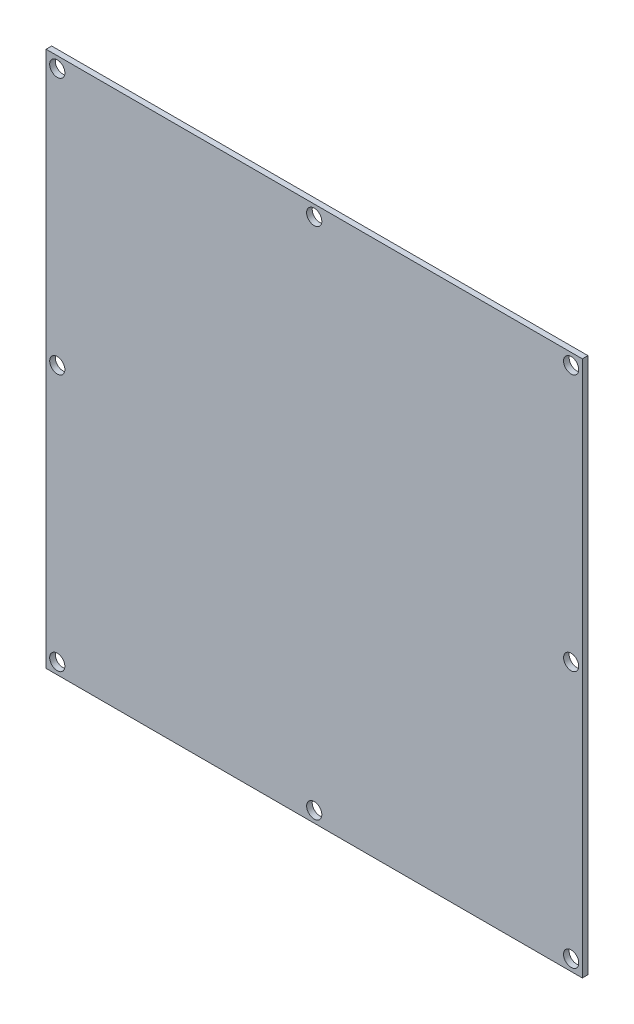
ISO-10303-21;
HEADER;
FILE_DESCRIPTION(('STEP AP214'),'2;1');
FILE_NAME('part.step','',(''),(''),'','','');
FILE_SCHEMA(('AUTOMOTIVE_DESIGN { 1 0 10303 214 1 1 1 1 }'));
ENDSEC;
DATA;
#1=APPLICATION_CONTEXT('core data for automotive mechanical design processes');
#2=APPLICATION_PROTOCOL_DEFINITION('international standard','automotive_design',2000,#1);
#3=PRODUCT_CONTEXT('',#1,'mechanical');
#4=PRODUCT('Part','Part','',(#3));
#5=PRODUCT_RELATED_PRODUCT_CATEGORY('part','',(#4));
#6=PRODUCT_DEFINITION_FORMATION('','',#4);
#7=PRODUCT_DEFINITION_CONTEXT('part definition',#1,'design');
#8=PRODUCT_DEFINITION('design','',#6,#7);
#9=PRODUCT_DEFINITION_SHAPE('','',#8);
#10=(LENGTH_UNIT() NAMED_UNIT(*) SI_UNIT(.MILLI.,.METRE.));
#11=(NAMED_UNIT(*) PLANE_ANGLE_UNIT() SI_UNIT($,.RADIAN.));
#12=(NAMED_UNIT(*) SI_UNIT($,.STERADIAN.) SOLID_ANGLE_UNIT());
#13=UNCERTAINTY_MEASURE_WITH_UNIT(LENGTH_MEASURE(1.E-05),#10,'distance_accuracy_value','');
#14=(GEOMETRIC_REPRESENTATION_CONTEXT(3) GLOBAL_UNCERTAINTY_ASSIGNED_CONTEXT((#13)) GLOBAL_UNIT_ASSIGNED_CONTEXT((#10,
#11,#12)) REPRESENTATION_CONTEXT('',''));
#15=CARTESIAN_POINT('',(0.,0.,0.));
#16=DIRECTION('',(0.,0.,1.));
#17=DIRECTION('',(1.,0.,0.));
#18=AXIS2_PLACEMENT_3D('',#15,#16,#17);
#19=CARTESIAN_POINT('',(0.,0.,1.5875));
#20=DIRECTION('',(1.,0.,0.));
#21=DIRECTION('',(0.,0.,-1.));
#22=AXIS2_PLACEMENT_3D('',#19,#20,#21);
#23=PLANE('',#22);
#24=DIRECTION('',(0.,-1.,0.));
#25=VECTOR('',#24,1.);
#26=CARTESIAN_POINT('',(0.,0.,0.));
#27=LINE('',#26,#25);
#28=CARTESIAN_POINT('',(0.,152.4,0.));
#29=VERTEX_POINT('',#28);
#30=CARTESIAN_POINT('',(0.,0.,0.));
#31=VERTEX_POINT('',#30);
#32=EDGE_CURVE('E96',#29,#31,#27,.T.);
#33=ORIENTED_EDGE('',*,*,#32,.T.);
#34=DIRECTION('',(0.,0.,-1.));
#35=VECTOR('',#34,1.);
#36=CARTESIAN_POINT('',(0.,0.,1.5875));
#37=LINE('',#36,#35);
#38=CARTESIAN_POINT('',(0.,0.,1.5875));
#39=VERTEX_POINT('',#38);
#40=EDGE_CURVE('E11',#39,#31,#37,.T.);
#41=ORIENTED_EDGE('',*,*,#40,.F.);
#42=DIRECTION('',(0.,-1.,0.));
#43=VECTOR('',#42,1.);
#44=CARTESIAN_POINT('',(0.,0.,1.5875));
#45=LINE('',#44,#43);
#46=CARTESIAN_POINT('',(0.,152.4,1.5875));
#47=VERTEX_POINT('',#46);
#48=EDGE_CURVE('E84',#47,#39,#45,.T.);
#49=ORIENTED_EDGE('',*,*,#48,.F.);
#50=DIRECTION('',(0.,0.,-1.));
#51=VECTOR('',#50,1.);
#52=CARTESIAN_POINT('',(0.,152.4,1.5875));
#53=LINE('',#52,#51);
#54=EDGE_CURVE('E92',#47,#29,#53,.T.);
#55=ORIENTED_EDGE('',*,*,#54,.T.);
#56=EDGE_LOOP('',(#33,#41,#49,#55));
#57=FACE_BOUND('',#56,.T.);
#58=ADVANCED_FACE('F33',(#57),#23,.F.);
#59=CARTESIAN_POINT('',(0.,0.,1.5875));
#60=DIRECTION('',(0.,1.,0.));
#61=DIRECTION('',(0.,0.,1.));
#62=AXIS2_PLACEMENT_3D('',#59,#60,#61);
#63=PLANE('',#62);
#64=DIRECTION('',(1.,0.,0.));
#65=VECTOR('',#64,1.);
#66=CARTESIAN_POINT('',(0.,0.,0.));
#67=LINE('',#66,#65);
#68=CARTESIAN_POINT('',(152.4,0.,0.));
#69=VERTEX_POINT('',#68);
#70=EDGE_CURVE('E88',#31,#69,#67,.T.);
#71=ORIENTED_EDGE('',*,*,#70,.T.);
#72=DIRECTION('',(0.,0.,-1.));
#73=VECTOR('',#72,1.);
#74=CARTESIAN_POINT('',(152.4,0.,1.5875));
#75=LINE('',#74,#73);
#76=CARTESIAN_POINT('',(152.4,0.,1.5875));
#77=VERTEX_POINT('',#76);
#78=EDGE_CURVE('E41',#77,#69,#75,.T.);
#79=ORIENTED_EDGE('',*,*,#78,.F.);
#80=DIRECTION('',(1.,0.,0.));
#81=VECTOR('',#80,1.);
#82=CARTESIAN_POINT('',(0.,0.,1.5875));
#83=LINE('',#82,#81);
#84=EDGE_CURVE('E79',#39,#77,#83,.T.);
#85=ORIENTED_EDGE('',*,*,#84,.F.);
#86=ORIENTED_EDGE('',*,*,#40,.T.);
#87=EDGE_LOOP('',(#71,#79,#85,#86));
#88=FACE_BOUND('',#87,.T.);
#89=ADVANCED_FACE('F87',(#88),#63,.F.);
#90=CARTESIAN_POINT('',(152.4,0.,1.5875));
#91=DIRECTION('',(-1.,0.,0.));
#92=DIRECTION('',(0.,0.,1.));
#93=AXIS2_PLACEMENT_3D('',#90,#91,#92);
#94=PLANE('',#93);
#95=DIRECTION('',(0.,1.,0.));
#96=VECTOR('',#95,1.);
#97=CARTESIAN_POINT('',(152.4,0.,0.));
#98=LINE('',#97,#96);
#99=CARTESIAN_POINT('',(152.4,152.4,0.));
#100=VERTEX_POINT('',#99);
#101=EDGE_CURVE('E66',#69,#100,#98,.T.);
#102=ORIENTED_EDGE('',*,*,#101,.T.);
#103=DIRECTION('',(0.,0.,-1.));
#104=VECTOR('',#103,1.);
#105=CARTESIAN_POINT('',(152.4,152.4,1.5875));
#106=LINE('',#105,#104);
#107=CARTESIAN_POINT('',(152.4,152.4,1.5875));
#108=VERTEX_POINT('',#107);
#109=EDGE_CURVE('E89',#108,#100,#106,.T.);
#110=ORIENTED_EDGE('',*,*,#109,.F.);
#111=DIRECTION('',(0.,1.,0.));
#112=VECTOR('',#111,1.);
#113=CARTESIAN_POINT('',(152.4,0.,1.5875));
#114=LINE('',#113,#112);
#115=EDGE_CURVE('E82',#77,#108,#114,.T.);
#116=ORIENTED_EDGE('',*,*,#115,.F.);
#117=ORIENTED_EDGE('',*,*,#78,.T.);
#118=EDGE_LOOP('',(#102,#110,#116,#117));
#119=FACE_BOUND('',#118,.T.);
#120=ADVANCED_FACE('F90',(#119),#94,.F.);
#121=CARTESIAN_POINT('',(0.,152.4,1.5875));
#122=DIRECTION('',(0.,-1.,0.));
#123=DIRECTION('',(0.,0.,-1.));
#124=AXIS2_PLACEMENT_3D('',#121,#122,#123);
#125=PLANE('',#124);
#126=DIRECTION('',(-1.,0.,0.));
#127=VECTOR('',#126,1.);
#128=CARTESIAN_POINT('',(0.,152.4,0.));
#129=LINE('',#128,#127);
#130=EDGE_CURVE('E72',#100,#29,#129,.T.);
#131=ORIENTED_EDGE('',*,*,#130,.T.);
#132=ORIENTED_EDGE('',*,*,#54,.F.);
#133=DIRECTION('',(-1.,0.,0.));
#134=VECTOR('',#133,1.);
#135=CARTESIAN_POINT('',(0.,152.4,1.5875));
#136=LINE('',#135,#134);
#137=EDGE_CURVE('E49',#108,#47,#136,.T.);
#138=ORIENTED_EDGE('',*,*,#137,.F.);
#139=ORIENTED_EDGE('',*,*,#109,.T.);
#140=EDGE_LOOP('',(#131,#132,#138,#139));
#141=FACE_BOUND('',#140,.T.);
#142=ADVANCED_FACE('F104',(#141),#125,.F.);
#143=CARTESIAN_POINT('',(0.,0.,1.5875));
#144=DIRECTION('',(0.,0.,-1.));
#145=DIRECTION('',(-1.,0.,0.));
#146=AXIS2_PLACEMENT_3D('',#143,#144,#145);
#147=PLANE('',#146);
#148=CARTESIAN_POINT('',(3.175,76.2,1.5875));
#149=DIRECTION('',(0.,0.,1.));
#150=DIRECTION('',(1.,0.,0.));
#151=AXIS2_PLACEMENT_3D('',#148,#149,#150);
#152=CIRCLE('',#151,2.159);
#153=CARTESIAN_POINT('',(5.334,76.2,1.5875));
#154=VERTEX_POINT('',#153);
#155=EDGE_CURVE('E152',#154,#154,#152,.T.);
#156=ORIENTED_EDGE('',*,*,#155,.F.);
#157=EDGE_LOOP('',(#156));
#158=FACE_BOUND('',#157,.T.);
#159=CARTESIAN_POINT('',(149.225,76.2,1.5875));
#160=DIRECTION('',(0.,0.,1.));
#161=DIRECTION('',(1.,0.,0.));
#162=AXIS2_PLACEMENT_3D('',#159,#160,#161);
#163=CIRCLE('',#162,2.15899999999999);
#164=CARTESIAN_POINT('',(151.384,76.2,1.5875));
#165=VERTEX_POINT('',#164);
#166=EDGE_CURVE('E146',#165,#165,#163,.T.);
#167=ORIENTED_EDGE('',*,*,#166,.F.);
#168=EDGE_LOOP('',(#167));
#169=FACE_BOUND('',#168,.T.);
#170=CARTESIAN_POINT('',(149.225,3.175,1.5875));
#171=DIRECTION('',(0.,0.,1.));
#172=DIRECTION('',(1.,0.,0.));
#173=AXIS2_PLACEMENT_3D('',#170,#171,#172);
#174=CIRCLE('',#173,2.15899999999999);
#175=CARTESIAN_POINT('',(151.384,3.175,1.5875));
#176=VERTEX_POINT('',#175);
#177=EDGE_CURVE('E140',#176,#176,#174,.T.);
#178=ORIENTED_EDGE('',*,*,#177,.F.);
#179=EDGE_LOOP('',(#178));
#180=FACE_BOUND('',#179,.T.);
#181=CARTESIAN_POINT('',(3.175,3.175,1.5875));
#182=DIRECTION('',(0.,0.,1.));
#183=DIRECTION('',(1.,0.,0.));
#184=AXIS2_PLACEMENT_3D('',#181,#182,#183);
#185=CIRCLE('',#184,2.159);
#186=CARTESIAN_POINT('',(5.334,3.175,1.5875));
#187=VERTEX_POINT('',#186);
#188=EDGE_CURVE('E134',#187,#187,#185,.T.);
#189=ORIENTED_EDGE('',*,*,#188,.F.);
#190=EDGE_LOOP('',(#189));
#191=FACE_BOUND('',#190,.T.);
#192=CARTESIAN_POINT('',(76.2,3.175,1.5875));
#193=DIRECTION('',(0.,0.,1.));
#194=DIRECTION('',(1.,0.,0.));
#195=AXIS2_PLACEMENT_3D('',#192,#193,#194);
#196=CIRCLE('',#195,2.15899999999999);
#197=CARTESIAN_POINT('',(78.359,3.175,1.5875));
#198=VERTEX_POINT('',#197);
#199=EDGE_CURVE('E128',#198,#198,#196,.T.);
#200=ORIENTED_EDGE('',*,*,#199,.F.);
#201=EDGE_LOOP('',(#200));
#202=FACE_BOUND('',#201,.T.);
#203=CARTESIAN_POINT('',(149.225,149.225,1.5875));
#204=DIRECTION('',(0.,0.,1.));
#205=DIRECTION('',(1.,0.,0.));
#206=AXIS2_PLACEMENT_3D('',#203,#204,#205);
#207=CIRCLE('',#206,2.15899999999999);
#208=CARTESIAN_POINT('',(151.384,149.225,1.5875));
#209=VERTEX_POINT('',#208);
#210=EDGE_CURVE('E122',#209,#209,#207,.T.);
#211=ORIENTED_EDGE('',*,*,#210,.F.);
#212=EDGE_LOOP('',(#211));
#213=FACE_BOUND('',#212,.T.);
#214=CARTESIAN_POINT('',(76.2,149.225,1.5875));
#215=DIRECTION('',(0.,0.,1.));
#216=DIRECTION('',(1.,0.,0.));
#217=AXIS2_PLACEMENT_3D('',#214,#215,#216);
#218=CIRCLE('',#217,2.15899999999999);
#219=CARTESIAN_POINT('',(78.359,149.225,1.5875));
#220=VERTEX_POINT('',#219);
#221=EDGE_CURVE('E116',#220,#220,#218,.T.);
#222=ORIENTED_EDGE('',*,*,#221,.F.);
#223=EDGE_LOOP('',(#222));
#224=FACE_BOUND('',#223,.T.);
#225=CARTESIAN_POINT('',(3.175,149.225,1.5875));
#226=DIRECTION('',(0.,0.,1.));
#227=DIRECTION('',(1.,0.,0.));
#228=AXIS2_PLACEMENT_3D('',#225,#226,#227);
#229=CIRCLE('',#228,2.159);
#230=CARTESIAN_POINT('',(5.334,149.225,1.5875));
#231=VERTEX_POINT('',#230);
#232=EDGE_CURVE('E110',#231,#231,#229,.T.);
#233=ORIENTED_EDGE('',*,*,#232,.F.);
#234=EDGE_LOOP('',(#233));
#235=FACE_BOUND('',#234,.T.);
#236=ORIENTED_EDGE('',*,*,#48,.T.);
#237=ORIENTED_EDGE('',*,*,#84,.T.);
#238=ORIENTED_EDGE('',*,*,#115,.T.);
#239=ORIENTED_EDGE('',*,*,#137,.T.);
#240=EDGE_LOOP('',(#236,#237,#238,#239));
#241=FACE_BOUND('',#240,.T.);
#242=ADVANCED_FACE('F80',(#158,#169,#180,#191,#202,#213,#224,#235,#241),#147,.F.);
#243=CARTESIAN_POINT('',(0.,0.,0.));
#244=DIRECTION('',(0.,0.,-1.));
#245=DIRECTION('',(-1.,0.,0.));
#246=AXIS2_PLACEMENT_3D('',#243,#244,#245);
#247=PLANE('',#246);
#248=CARTESIAN_POINT('',(3.175,76.2,0.));
#249=DIRECTION('',(0.,0.,1.));
#250=DIRECTION('',(1.,0.,0.));
#251=AXIS2_PLACEMENT_3D('',#248,#249,#250);
#252=CIRCLE('',#251,2.159);
#253=CARTESIAN_POINT('',(5.334,76.2,0.));
#254=VERTEX_POINT('',#253);
#255=EDGE_CURVE('E149',#254,#254,#252,.T.);
#256=ORIENTED_EDGE('',*,*,#255,.T.);
#257=EDGE_LOOP('',(#256));
#258=FACE_BOUND('',#257,.T.);
#259=CARTESIAN_POINT('',(149.225,76.2,0.));
#260=DIRECTION('',(0.,0.,1.));
#261=DIRECTION('',(1.,0.,0.));
#262=AXIS2_PLACEMENT_3D('',#259,#260,#261);
#263=CIRCLE('',#262,2.15899999999999);
#264=CARTESIAN_POINT('',(151.384,76.2,0.));
#265=VERTEX_POINT('',#264);
#266=EDGE_CURVE('E143',#265,#265,#263,.T.);
#267=ORIENTED_EDGE('',*,*,#266,.T.);
#268=EDGE_LOOP('',(#267));
#269=FACE_BOUND('',#268,.T.);
#270=CARTESIAN_POINT('',(149.225,3.175,0.));
#271=DIRECTION('',(0.,0.,1.));
#272=DIRECTION('',(1.,0.,0.));
#273=AXIS2_PLACEMENT_3D('',#270,#271,#272);
#274=CIRCLE('',#273,2.15899999999999);
#275=CARTESIAN_POINT('',(151.384,3.175,0.));
#276=VERTEX_POINT('',#275);
#277=EDGE_CURVE('E137',#276,#276,#274,.T.);
#278=ORIENTED_EDGE('',*,*,#277,.T.);
#279=EDGE_LOOP('',(#278));
#280=FACE_BOUND('',#279,.T.);
#281=CARTESIAN_POINT('',(3.175,3.175,0.));
#282=DIRECTION('',(0.,0.,1.));
#283=DIRECTION('',(1.,0.,0.));
#284=AXIS2_PLACEMENT_3D('',#281,#282,#283);
#285=CIRCLE('',#284,2.159);
#286=CARTESIAN_POINT('',(5.334,3.175,0.));
#287=VERTEX_POINT('',#286);
#288=EDGE_CURVE('E131',#287,#287,#285,.T.);
#289=ORIENTED_EDGE('',*,*,#288,.T.);
#290=EDGE_LOOP('',(#289));
#291=FACE_BOUND('',#290,.T.);
#292=CARTESIAN_POINT('',(76.2,3.175,0.));
#293=DIRECTION('',(0.,0.,1.));
#294=DIRECTION('',(1.,0.,0.));
#295=AXIS2_PLACEMENT_3D('',#292,#293,#294);
#296=CIRCLE('',#295,2.15899999999999);
#297=CARTESIAN_POINT('',(78.359,3.175,0.));
#298=VERTEX_POINT('',#297);
#299=EDGE_CURVE('E125',#298,#298,#296,.T.);
#300=ORIENTED_EDGE('',*,*,#299,.T.);
#301=EDGE_LOOP('',(#300));
#302=FACE_BOUND('',#301,.T.);
#303=CARTESIAN_POINT('',(149.225,149.225,0.));
#304=DIRECTION('',(0.,0.,1.));
#305=DIRECTION('',(1.,0.,0.));
#306=AXIS2_PLACEMENT_3D('',#303,#304,#305);
#307=CIRCLE('',#306,2.15899999999999);
#308=CARTESIAN_POINT('',(151.384,149.225,0.));
#309=VERTEX_POINT('',#308);
#310=EDGE_CURVE('E119',#309,#309,#307,.T.);
#311=ORIENTED_EDGE('',*,*,#310,.T.);
#312=EDGE_LOOP('',(#311));
#313=FACE_BOUND('',#312,.T.);
#314=CARTESIAN_POINT('',(76.2,149.225,0.));
#315=DIRECTION('',(0.,0.,1.));
#316=DIRECTION('',(1.,0.,0.));
#317=AXIS2_PLACEMENT_3D('',#314,#315,#316);
#318=CIRCLE('',#317,2.15899999999999);
#319=CARTESIAN_POINT('',(78.359,149.225,0.));
#320=VERTEX_POINT('',#319);
#321=EDGE_CURVE('E113',#320,#320,#318,.T.);
#322=ORIENTED_EDGE('',*,*,#321,.T.);
#323=EDGE_LOOP('',(#322));
#324=FACE_BOUND('',#323,.T.);
#325=CARTESIAN_POINT('',(3.175,149.225,0.));
#326=DIRECTION('',(0.,0.,1.));
#327=DIRECTION('',(1.,0.,0.));
#328=AXIS2_PLACEMENT_3D('',#325,#326,#327);
#329=CIRCLE('',#328,2.159);
#330=CARTESIAN_POINT('',(5.334,149.225,0.));
#331=VERTEX_POINT('',#330);
#332=EDGE_CURVE('E99',#331,#331,#329,.T.);
#333=ORIENTED_EDGE('',*,*,#332,.T.);
#334=EDGE_LOOP('',(#333));
#335=FACE_BOUND('',#334,.T.);
#336=ORIENTED_EDGE('',*,*,#32,.F.);
#337=ORIENTED_EDGE('',*,*,#130,.F.);
#338=ORIENTED_EDGE('',*,*,#101,.F.);
#339=ORIENTED_EDGE('',*,*,#70,.F.);
#340=EDGE_LOOP('',(#336,#337,#338,#339));
#341=FACE_BOUND('',#340,.T.);
#342=ADVANCED_FACE('F107',(#258,#269,#280,#291,#302,#313,#324,#335,#341),#247,.T.);
#343=CARTESIAN_POINT('',(3.175,149.225,0.));
#344=DIRECTION('',(0.,0.,1.));
#345=DIRECTION('',(1.,0.,0.));
#346=AXIS2_PLACEMENT_3D('',#343,#344,#345);
#347=CYLINDRICAL_SURFACE('',#346,2.159);
#348=ORIENTED_EDGE('',*,*,#332,.F.);
#349=EDGE_LOOP('',(#348));
#350=FACE_BOUND('',#349,.T.);
#351=ORIENTED_EDGE('',*,*,#232,.T.);
#352=EDGE_LOOP('',(#351));
#353=FACE_BOUND('',#352,.T.);
#354=ADVANCED_FACE('F184',(#350,#353),#347,.F.);
#355=CARTESIAN_POINT('',(76.2,149.225,0.));
#356=DIRECTION('',(0.,0.,1.));
#357=DIRECTION('',(1.,0.,0.));
#358=AXIS2_PLACEMENT_3D('',#355,#356,#357);
#359=CYLINDRICAL_SURFACE('',#358,2.15899999999999);
#360=ORIENTED_EDGE('',*,*,#321,.F.);
#361=EDGE_LOOP('',(#360));
#362=FACE_BOUND('',#361,.T.);
#363=ORIENTED_EDGE('',*,*,#221,.T.);
#364=EDGE_LOOP('',(#363));
#365=FACE_BOUND('',#364,.T.);
#366=ADVANCED_FACE('F186',(#362,#365),#359,.F.);
#367=CARTESIAN_POINT('',(149.225,149.225,0.));
#368=DIRECTION('',(0.,0.,1.));
#369=DIRECTION('',(1.,0.,0.));
#370=AXIS2_PLACEMENT_3D('',#367,#368,#369);
#371=CYLINDRICAL_SURFACE('',#370,2.15899999999999);
#372=ORIENTED_EDGE('',*,*,#310,.F.);
#373=EDGE_LOOP('',(#372));
#374=FACE_BOUND('',#373,.T.);
#375=ORIENTED_EDGE('',*,*,#210,.T.);
#376=EDGE_LOOP('',(#375));
#377=FACE_BOUND('',#376,.T.);
#378=ADVANCED_FACE('F193',(#374,#377),#371,.F.);
#379=CARTESIAN_POINT('',(76.2,3.175,0.));
#380=DIRECTION('',(0.,0.,1.));
#381=DIRECTION('',(1.,0.,0.));
#382=AXIS2_PLACEMENT_3D('',#379,#380,#381);
#383=CYLINDRICAL_SURFACE('',#382,2.15899999999999);
#384=ORIENTED_EDGE('',*,*,#299,.F.);
#385=EDGE_LOOP('',(#384));
#386=FACE_BOUND('',#385,.T.);
#387=ORIENTED_EDGE('',*,*,#199,.T.);
#388=EDGE_LOOP('',(#387));
#389=FACE_BOUND('',#388,.T.);
#390=ADVANCED_FACE('F239',(#386,#389),#383,.F.);
#391=CARTESIAN_POINT('',(3.175,3.175,0.));
#392=DIRECTION('',(0.,0.,1.));
#393=DIRECTION('',(1.,0.,0.));
#394=AXIS2_PLACEMENT_3D('',#391,#392,#393);
#395=CYLINDRICAL_SURFACE('',#394,2.159);
#396=ORIENTED_EDGE('',*,*,#288,.F.);
#397=EDGE_LOOP('',(#396));
#398=FACE_BOUND('',#397,.T.);
#399=ORIENTED_EDGE('',*,*,#188,.T.);
#400=EDGE_LOOP('',(#399));
#401=FACE_BOUND('',#400,.T.);
#402=ADVANCED_FACE('F249',(#398,#401),#395,.F.);
#403=CARTESIAN_POINT('',(149.225,3.175,0.));
#404=DIRECTION('',(0.,0.,1.));
#405=DIRECTION('',(1.,0.,0.));
#406=AXIS2_PLACEMENT_3D('',#403,#404,#405);
#407=CYLINDRICAL_SURFACE('',#406,2.15899999999999);
#408=ORIENTED_EDGE('',*,*,#277,.F.);
#409=EDGE_LOOP('',(#408));
#410=FACE_BOUND('',#409,.T.);
#411=ORIENTED_EDGE('',*,*,#177,.T.);
#412=EDGE_LOOP('',(#411));
#413=FACE_BOUND('',#412,.T.);
#414=ADVANCED_FACE('F259',(#410,#413),#407,.F.);
#415=CARTESIAN_POINT('',(149.225,76.2,0.));
#416=DIRECTION('',(0.,0.,1.));
#417=DIRECTION('',(1.,0.,0.));
#418=AXIS2_PLACEMENT_3D('',#415,#416,#417);
#419=CYLINDRICAL_SURFACE('',#418,2.15899999999999);
#420=ORIENTED_EDGE('',*,*,#266,.F.);
#421=EDGE_LOOP('',(#420));
#422=FACE_BOUND('',#421,.T.);
#423=ORIENTED_EDGE('',*,*,#166,.T.);
#424=EDGE_LOOP('',(#423));
#425=FACE_BOUND('',#424,.T.);
#426=ADVANCED_FACE('F163',(#422,#425),#419,.F.);
#427=CARTESIAN_POINT('',(3.175,76.2,0.));
#428=DIRECTION('',(0.,0.,1.));
#429=DIRECTION('',(1.,0.,0.));
#430=AXIS2_PLACEMENT_3D('',#427,#428,#429);
#431=CYLINDRICAL_SURFACE('',#430,2.159);
#432=ORIENTED_EDGE('',*,*,#255,.F.);
#433=EDGE_LOOP('',(#432));
#434=FACE_BOUND('',#433,.T.);
#435=ORIENTED_EDGE('',*,*,#155,.T.);
#436=EDGE_LOOP('',(#435));
#437=FACE_BOUND('',#436,.T.);
#438=ADVANCED_FACE('F160',(#434,#437),#431,.F.);
#439=CLOSED_SHELL('',(#58,#89,#120,#142,#242,#342,#354,#366,#378,#390,#402,#414,#426,#438));
#440=MANIFOLD_SOLID_BREP('B2',#439);
#441=ADVANCED_BREP_SHAPE_REPRESENTATION('',(#18,#440),#14);
#442=SHAPE_DEFINITION_REPRESENTATION(#9,#441);
ENDSEC;
END-ISO-10303-21;
